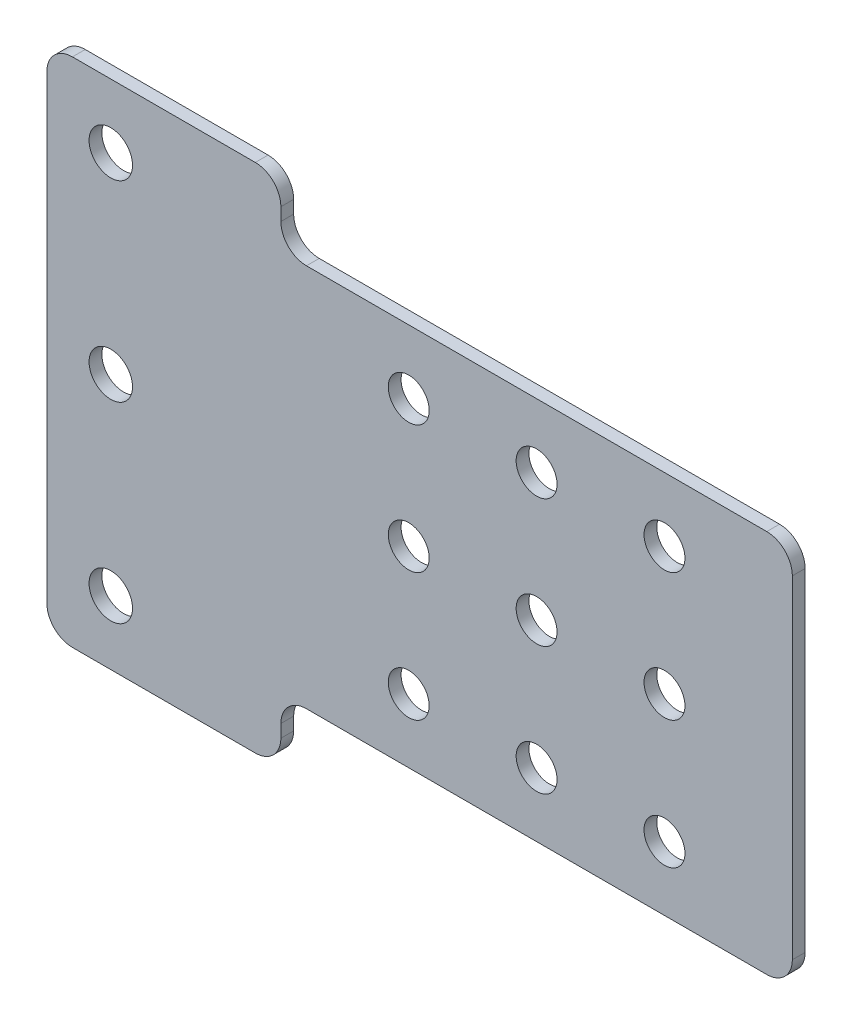
ISO-10303-21;
HEADER;
FILE_DESCRIPTION(('STEP AP214'),'2;1');
FILE_NAME('part.step','',(''),(''),'','','');
FILE_SCHEMA(('AUTOMOTIVE_DESIGN { 1 0 10303 214 1 1 1 1 }'));
ENDSEC;
DATA;
#1=APPLICATION_CONTEXT('core data for automotive mechanical design processes');
#2=APPLICATION_PROTOCOL_DEFINITION('international standard','automotive_design',2000,#1);
#3=PRODUCT_CONTEXT('',#1,'mechanical');
#4=PRODUCT('Part','Part','',(#3));
#5=PRODUCT_RELATED_PRODUCT_CATEGORY('part','',(#4));
#6=PRODUCT_DEFINITION_FORMATION('','',#4);
#7=PRODUCT_DEFINITION_CONTEXT('part definition',#1,'design');
#8=PRODUCT_DEFINITION('design','',#6,#7);
#9=PRODUCT_DEFINITION_SHAPE('','',#8);
#10=(LENGTH_UNIT() NAMED_UNIT(*) SI_UNIT(.MILLI.,.METRE.));
#11=(NAMED_UNIT(*) PLANE_ANGLE_UNIT() SI_UNIT($,.RADIAN.));
#12=(NAMED_UNIT(*) SI_UNIT($,.STERADIAN.) SOLID_ANGLE_UNIT());
#13=UNCERTAINTY_MEASURE_WITH_UNIT(LENGTH_MEASURE(1.E-05),#10,'distance_accuracy_value','');
#14=(GEOMETRIC_REPRESENTATION_CONTEXT(3) GLOBAL_UNCERTAINTY_ASSIGNED_CONTEXT((#13)) GLOBAL_UNIT_ASSIGNED_CONTEXT((#10,
#11,#12)) REPRESENTATION_CONTEXT('',''));
#15=CARTESIAN_POINT('',(0.,0.,0.));
#16=DIRECTION('',(0.,0.,1.));
#17=DIRECTION('',(1.,0.,0.));
#18=AXIS2_PLACEMENT_3D('',#15,#16,#17);
#19=CARTESIAN_POINT('',(0.,0.,1.27));
#20=DIRECTION('',(0.,0.,-1.));
#21=DIRECTION('',(-1.,0.,0.));
#22=AXIS2_PLACEMENT_3D('',#19,#20,#21);
#23=PLANE('',#22);
#24=DIRECTION('',(-1.,0.,0.));
#25=VECTOR('',#24,1.);
#26=CARTESIAN_POINT('',(0.,-25.4,1.27));
#27=LINE('',#26,#25);
#28=CARTESIAN_POINT('',(-27.94,-25.4,1.27));
#29=VERTEX_POINT('',#28);
#30=CARTESIAN_POINT('',(-46.101,-25.4,1.27));
#31=VERTEX_POINT('',#30);
#32=EDGE_CURVE('E345',#29,#31,#27,.T.);
#33=ORIENTED_EDGE('',*,*,#32,.F.);
#34=CARTESIAN_POINT('',(-27.94,-22.86,1.27));
#35=DIRECTION('',(0.,0.,-1.));
#36=DIRECTION('',(-1.,0.,0.));
#37=AXIS2_PLACEMENT_3D('',#34,#35,#36);
#38=CIRCLE('',#37,2.54);
#39=CARTESIAN_POINT('',(-25.4,-22.86,1.27));
#40=VERTEX_POINT('',#39);
#41=EDGE_CURVE('E212',#29,#40,#38,.F.);
#42=ORIENTED_EDGE('',*,*,#41,.T.);
#43=DIRECTION('',(0.,-1.,0.));
#44=VECTOR('',#43,1.);
#45=CARTESIAN_POINT('',(-25.4,0.,1.27));
#46=LINE('',#45,#44);
#47=CARTESIAN_POINT('',(-25.4,-21.59,1.27));
#48=VERTEX_POINT('',#47);
#49=EDGE_CURVE('E249',#48,#40,#46,.T.);
#50=ORIENTED_EDGE('',*,*,#49,.F.);
#51=CARTESIAN_POINT('',(-22.86,-21.59,1.27));
#52=DIRECTION('',(0.,0.,-1.));
#53=DIRECTION('',(-1.,0.,0.));
#54=AXIS2_PLACEMENT_3D('',#51,#52,#53);
#55=CIRCLE('',#54,2.54);
#56=CARTESIAN_POINT('',(-22.86,-19.05,1.27));
#57=VERTEX_POINT('',#56);
#58=EDGE_CURVE('E241',#48,#57,#55,.T.);
#59=ORIENTED_EDGE('',*,*,#58,.T.);
#60=DIRECTION('',(1.,0.,0.));
#61=VECTOR('',#60,1.);
#62=CARTESIAN_POINT('',(-25.4,-19.05,1.27));
#63=LINE('',#62,#61);
#64=CARTESIAN_POINT('',(22.86,-19.05,1.27));
#65=VERTEX_POINT('',#64);
#66=EDGE_CURVE('E180',#57,#65,#63,.T.);
#67=ORIENTED_EDGE('',*,*,#66,.T.);
#68=CARTESIAN_POINT('',(22.86,-16.51,1.27));
#69=DIRECTION('',(0.,0.,-1.));
#70=DIRECTION('',(-1.,0.,0.));
#71=AXIS2_PLACEMENT_3D('',#68,#69,#70);
#72=CIRCLE('',#71,2.54);
#73=CARTESIAN_POINT('',(25.4,-16.51,1.27));
#74=VERTEX_POINT('',#73);
#75=EDGE_CURVE('E189',#65,#74,#72,.F.);
#76=ORIENTED_EDGE('',*,*,#75,.T.);
#77=DIRECTION('',(0.,1.,0.));
#78=VECTOR('',#77,1.);
#79=CARTESIAN_POINT('',(25.4,-19.05,1.27));
#80=LINE('',#79,#78);
#81=CARTESIAN_POINT('',(25.4,16.51,1.27));
#82=VERTEX_POINT('',#81);
#83=EDGE_CURVE('E165',#74,#82,#80,.T.);
#84=ORIENTED_EDGE('',*,*,#83,.T.);
#85=CARTESIAN_POINT('',(22.86,16.51,1.27));
#86=DIRECTION('',(0.,0.,-1.));
#87=DIRECTION('',(-1.,0.,0.));
#88=AXIS2_PLACEMENT_3D('',#85,#86,#87);
#89=CIRCLE('',#88,2.54);
#90=CARTESIAN_POINT('',(22.86,19.05,1.27));
#91=VERTEX_POINT('',#90);
#92=EDGE_CURVE('E187',#82,#91,#89,.F.);
#93=ORIENTED_EDGE('',*,*,#92,.T.);
#94=DIRECTION('',(-1.,0.,0.));
#95=VECTOR('',#94,1.);
#96=CARTESIAN_POINT('',(-25.4,19.05,1.27));
#97=LINE('',#96,#95);
#98=CARTESIAN_POINT('',(-22.86,19.05,1.27));
#99=VERTEX_POINT('',#98);
#100=EDGE_CURVE('E255',#91,#99,#97,.T.);
#101=ORIENTED_EDGE('',*,*,#100,.T.);
#102=CARTESIAN_POINT('',(-22.86,21.59,1.27));
#103=DIRECTION('',(0.,0.,-1.));
#104=DIRECTION('',(-1.,0.,0.));
#105=AXIS2_PLACEMENT_3D('',#102,#103,#104);
#106=CIRCLE('',#105,2.54);
#107=CARTESIAN_POINT('',(-25.4,21.59,1.27));
#108=VERTEX_POINT('',#107);
#109=EDGE_CURVE('E11',#99,#108,#106,.T.);
#110=ORIENTED_EDGE('',*,*,#109,.T.);
#111=CARTESIAN_POINT('',(-25.4,22.86,1.27));
#112=VERTEX_POINT('',#111);
#113=EDGE_CURVE('E337',#112,#108,#46,.T.);
#114=ORIENTED_EDGE('',*,*,#113,.F.);
#115=CARTESIAN_POINT('',(-27.94,22.86,1.27));
#116=DIRECTION('',(0.,0.,-1.));
#117=DIRECTION('',(-1.,0.,0.));
#118=AXIS2_PLACEMENT_3D('',#115,#116,#117);
#119=CIRCLE('',#118,2.54);
#120=CARTESIAN_POINT('',(-27.94,25.4,1.27));
#121=VERTEX_POINT('',#120);
#122=EDGE_CURVE('E208',#112,#121,#119,.F.);
#123=ORIENTED_EDGE('',*,*,#122,.T.);
#124=DIRECTION('',(1.,0.,0.));
#125=VECTOR('',#124,1.);
#126=CARTESIAN_POINT('',(0.,25.4,1.27));
#127=LINE('',#126,#125);
#128=CARTESIAN_POINT('',(-46.101,25.4,1.27));
#129=VERTEX_POINT('',#128);
#130=EDGE_CURVE('E352',#129,#121,#127,.T.);
#131=ORIENTED_EDGE('',*,*,#130,.F.);
#132=CARTESIAN_POINT('',(-46.101,22.86,1.27));
#133=DIRECTION('',(0.,0.,-1.));
#134=DIRECTION('',(-1.,0.,0.));
#135=AXIS2_PLACEMENT_3D('',#132,#133,#134);
#136=CIRCLE('',#135,2.54);
#137=CARTESIAN_POINT('',(-48.641,22.86,1.27));
#138=VERTEX_POINT('',#137);
#139=EDGE_CURVE('E206',#129,#138,#136,.F.);
#140=ORIENTED_EDGE('',*,*,#139,.T.);
#141=DIRECTION('',(0.,1.,0.));
#142=VECTOR('',#141,1.);
#143=CARTESIAN_POINT('',(-48.641,0.,1.27));
#144=LINE('',#143,#142);
#145=CARTESIAN_POINT('',(-48.641,-22.86,1.27));
#146=VERTEX_POINT('',#145);
#147=EDGE_CURVE('E348',#146,#138,#144,.T.);
#148=ORIENTED_EDGE('',*,*,#147,.F.);
#149=CARTESIAN_POINT('',(-46.101,-22.86,1.27));
#150=DIRECTION('',(0.,0.,-1.));
#151=DIRECTION('',(-1.,0.,0.));
#152=AXIS2_PLACEMENT_3D('',#149,#150,#151);
#153=CIRCLE('',#152,2.54);
#154=EDGE_CURVE('E210',#146,#31,#153,.F.);
#155=ORIENTED_EDGE('',*,*,#154,.T.);
#156=EDGE_LOOP('',(#33,#42,#50,#59,#67,#76,#84,#93,#101,#110,#114,#123,#131,#140,#148,#155));
#157=FACE_BOUND('',#156,.T.);
#158=CARTESIAN_POINT('',(-12.7,12.7,1.27));
#159=DIRECTION('',(0.,0.,1.));
#160=DIRECTION('',(1.,0.,0.));
#161=AXIS2_PLACEMENT_3D('',#158,#159,#160);
#162=CIRCLE('',#161,2.032);
#163=CARTESIAN_POINT('',(-10.668,12.7,1.27));
#164=VERTEX_POINT('',#163);
#165=EDGE_CURVE('E172',#164,#164,#162,.T.);
#166=ORIENTED_EDGE('',*,*,#165,.F.);
#167=EDGE_LOOP('',(#166));
#168=FACE_BOUND('',#167,.T.);
#169=CARTESIAN_POINT('',(0.,12.7,1.27));
#170=DIRECTION('',(0.,0.,1.));
#171=DIRECTION('',(1.,0.,0.));
#172=AXIS2_PLACEMENT_3D('',#169,#170,#171);
#173=CIRCLE('',#172,2.032);
#174=CARTESIAN_POINT('',(2.03200000000001,12.7,1.27));
#175=VERTEX_POINT('',#174);
#176=EDGE_CURVE('E317',#175,#175,#173,.T.);
#177=ORIENTED_EDGE('',*,*,#176,.F.);
#178=EDGE_LOOP('',(#177));
#179=FACE_BOUND('',#178,.T.);
#180=CARTESIAN_POINT('',(12.7,12.7,1.27));
#181=DIRECTION('',(0.,0.,1.));
#182=DIRECTION('',(1.,0.,0.));
#183=AXIS2_PLACEMENT_3D('',#180,#181,#182);
#184=CIRCLE('',#183,2.032);
#185=CARTESIAN_POINT('',(14.732,12.7,1.27));
#186=VERTEX_POINT('',#185);
#187=EDGE_CURVE('E311',#186,#186,#184,.T.);
#188=ORIENTED_EDGE('',*,*,#187,.F.);
#189=EDGE_LOOP('',(#188));
#190=FACE_BOUND('',#189,.T.);
#191=CARTESIAN_POINT('',(1.40512601554121E-13,0.,1.27));
#192=DIRECTION('',(0.,0.,1.));
#193=DIRECTION('',(1.,0.,0.));
#194=AXIS2_PLACEMENT_3D('',#191,#192,#193);
#195=CIRCLE('',#194,2.032);
#196=CARTESIAN_POINT('',(2.03200000000014,0.,1.27));
#197=VERTEX_POINT('',#196);
#198=EDGE_CURVE('E305',#197,#197,#195,.T.);
#199=ORIENTED_EDGE('',*,*,#198,.F.);
#200=EDGE_LOOP('',(#199));
#201=FACE_BOUND('',#200,.T.);
#202=CARTESIAN_POINT('',(12.7000000000001,0.,1.27));
#203=DIRECTION('',(0.,0.,1.));
#204=DIRECTION('',(1.,0.,0.));
#205=AXIS2_PLACEMENT_3D('',#202,#203,#204);
#206=CIRCLE('',#205,2.032);
#207=CARTESIAN_POINT('',(14.7320000000001,0.,1.27));
#208=VERTEX_POINT('',#207);
#209=EDGE_CURVE('E299',#208,#208,#206,.T.);
#210=ORIENTED_EDGE('',*,*,#209,.F.);
#211=EDGE_LOOP('',(#210));
#212=FACE_BOUND('',#211,.T.);
#213=CARTESIAN_POINT('',(2.72351585728359E-13,-12.7,1.27));
#214=DIRECTION('',(0.,0.,1.));
#215=DIRECTION('',(1.,0.,0.));
#216=AXIS2_PLACEMENT_3D('',#213,#214,#215);
#217=CIRCLE('',#216,2.032);
#218=CARTESIAN_POINT('',(2.03200000000027,-12.7,1.27));
#219=VERTEX_POINT('',#218);
#220=EDGE_CURVE('E293',#219,#219,#217,.T.);
#221=ORIENTED_EDGE('',*,*,#220,.F.);
#222=EDGE_LOOP('',(#221));
#223=FACE_BOUND('',#222,.T.);
#224=CARTESIAN_POINT('',(12.7000000000003,-12.7,1.27));
#225=DIRECTION('',(0.,0.,1.));
#226=DIRECTION('',(1.,0.,0.));
#227=AXIS2_PLACEMENT_3D('',#224,#225,#226);
#228=CIRCLE('',#227,2.032);
#229=CARTESIAN_POINT('',(14.7320000000003,-12.7,1.27));
#230=VERTEX_POINT('',#229);
#231=EDGE_CURVE('E287',#230,#230,#228,.T.);
#232=ORIENTED_EDGE('',*,*,#231,.F.);
#233=EDGE_LOOP('',(#232));
#234=FACE_BOUND('',#233,.T.);
#235=CARTESIAN_POINT('',(-12.6999999999999,0.,1.27));
#236=DIRECTION('',(0.,0.,1.));
#237=DIRECTION('',(1.,0.,0.));
#238=AXIS2_PLACEMENT_3D('',#235,#236,#237);
#239=CIRCLE('',#238,2.032);
#240=CARTESIAN_POINT('',(-10.6679999999999,0.,1.27));
#241=VERTEX_POINT('',#240);
#242=EDGE_CURVE('E281',#241,#241,#239,.T.);
#243=ORIENTED_EDGE('',*,*,#242,.F.);
#244=EDGE_LOOP('',(#243));
#245=FACE_BOUND('',#244,.T.);
#246=CARTESIAN_POINT('',(-12.6999999999997,-12.7,1.27));
#247=DIRECTION('',(0.,0.,1.));
#248=DIRECTION('',(1.,0.,0.));
#249=AXIS2_PLACEMENT_3D('',#246,#247,#248);
#250=CIRCLE('',#249,2.032);
#251=CARTESIAN_POINT('',(-10.6679999999997,-12.7,1.27));
#252=VERTEX_POINT('',#251);
#253=EDGE_CURVE('E273',#252,#252,#250,.T.);
#254=ORIENTED_EDGE('',*,*,#253,.F.);
#255=EDGE_LOOP('',(#254));
#256=FACE_BOUND('',#255,.T.);
#257=CARTESIAN_POINT('',(-42.291,19.05,1.27));
#258=DIRECTION('',(0.,0.,1.));
#259=DIRECTION('',(1.,0.,0.));
#260=AXIS2_PLACEMENT_3D('',#257,#258,#259);
#261=CIRCLE('',#260,2.159);
#262=CARTESIAN_POINT('',(-40.132,19.05,1.27));
#263=VERTEX_POINT('',#262);
#264=EDGE_CURVE('E360',#263,#263,#261,.T.);
#265=ORIENTED_EDGE('',*,*,#264,.F.);
#266=EDGE_LOOP('',(#265));
#267=FACE_BOUND('',#266,.T.);
#268=CARTESIAN_POINT('',(-42.291,-19.05,1.27));
#269=DIRECTION('',(0.,0.,1.));
#270=DIRECTION('',(1.,0.,0.));
#271=AXIS2_PLACEMENT_3D('',#268,#269,#270);
#272=CIRCLE('',#271,2.159);
#273=CARTESIAN_POINT('',(-40.132,-19.05,1.27));
#274=VERTEX_POINT('',#273);
#275=EDGE_CURVE('E357',#274,#274,#272,.T.);
#276=ORIENTED_EDGE('',*,*,#275,.F.);
#277=EDGE_LOOP('',(#276));
#278=FACE_BOUND('',#277,.T.);
#279=CARTESIAN_POINT('',(-42.291,0.,1.27));
#280=DIRECTION('',(0.,0.,1.));
#281=DIRECTION('',(1.,0.,0.));
#282=AXIS2_PLACEMENT_3D('',#279,#280,#281);
#283=CIRCLE('',#282,2.159);
#284=CARTESIAN_POINT('',(-40.132,0.,1.27));
#285=VERTEX_POINT('',#284);
#286=EDGE_CURVE('E354',#285,#285,#283,.T.);
#287=ORIENTED_EDGE('',*,*,#286,.F.);
#288=EDGE_LOOP('',(#287));
#289=FACE_BOUND('',#288,.T.);
#290=ADVANCED_FACE('F34',(#157,#168,#179,#190,#201,#212,#223,#234,#245,#256,#267,#278,#289),#23,.F.);
#291=CARTESIAN_POINT('',(0.,0.,0.));
#292=DIRECTION('',(0.,0.,-1.));
#293=DIRECTION('',(-1.,0.,0.));
#294=AXIS2_PLACEMENT_3D('',#291,#292,#293);
#295=PLANE('',#294);
#296=CARTESIAN_POINT('',(-12.6999999999999,0.,0.));
#297=DIRECTION('',(0.,0.,1.));
#298=DIRECTION('',(1.,0.,0.));
#299=AXIS2_PLACEMENT_3D('',#296,#297,#298);
#300=CIRCLE('',#299,2.032);
#301=CARTESIAN_POINT('',(-10.6679999999999,0.,0.));
#302=VERTEX_POINT('',#301);
#303=EDGE_CURVE('E276',#302,#302,#300,.T.);
#304=ORIENTED_EDGE('',*,*,#303,.T.);
#305=EDGE_LOOP('',(#304));
#306=FACE_BOUND('',#305,.T.);
#307=CARTESIAN_POINT('',(2.72351585728359E-13,-12.7,0.));
#308=DIRECTION('',(0.,0.,1.));
#309=DIRECTION('',(1.,0.,0.));
#310=AXIS2_PLACEMENT_3D('',#307,#308,#309);
#311=CIRCLE('',#310,2.032);
#312=CARTESIAN_POINT('',(2.03200000000027,-12.7,0.));
#313=VERTEX_POINT('',#312);
#314=EDGE_CURVE('E290',#313,#313,#311,.T.);
#315=ORIENTED_EDGE('',*,*,#314,.T.);
#316=EDGE_LOOP('',(#315));
#317=FACE_BOUND('',#316,.T.);
#318=CARTESIAN_POINT('',(1.40512601554121E-13,0.,0.));
#319=DIRECTION('',(0.,0.,1.));
#320=DIRECTION('',(1.,0.,0.));
#321=AXIS2_PLACEMENT_3D('',#318,#319,#320);
#322=CIRCLE('',#321,2.032);
#323=CARTESIAN_POINT('',(2.03200000000014,0.,0.));
#324=VERTEX_POINT('',#323);
#325=EDGE_CURVE('E302',#324,#324,#322,.T.);
#326=ORIENTED_EDGE('',*,*,#325,.T.);
#327=EDGE_LOOP('',(#326));
#328=FACE_BOUND('',#327,.T.);
#329=CARTESIAN_POINT('',(0.,12.7,0.));
#330=DIRECTION('',(0.,0.,1.));
#331=DIRECTION('',(1.,0.,0.));
#332=AXIS2_PLACEMENT_3D('',#329,#330,#331);
#333=CIRCLE('',#332,2.032);
#334=CARTESIAN_POINT('',(2.03200000000001,12.7,0.));
#335=VERTEX_POINT('',#334);
#336=EDGE_CURVE('E314',#335,#335,#333,.T.);
#337=ORIENTED_EDGE('',*,*,#336,.T.);
#338=EDGE_LOOP('',(#337));
#339=FACE_BOUND('',#338,.T.);
#340=DIRECTION('',(0.,-1.,0.));
#341=VECTOR('',#340,1.);
#342=CARTESIAN_POINT('',(-25.4,0.,0.));
#343=LINE('',#342,#341);
#344=CARTESIAN_POINT('',(-25.4,-21.59,0.));
#345=VERTEX_POINT('',#344);
#346=CARTESIAN_POINT('',(-25.4,-22.86,0.));
#347=VERTEX_POINT('',#346);
#348=EDGE_CURVE('E258',#345,#347,#343,.T.);
#349=ORIENTED_EDGE('',*,*,#348,.T.);
#350=CARTESIAN_POINT('',(-27.94,-22.86,0.));
#351=DIRECTION('',(0.,0.,-1.));
#352=DIRECTION('',(-1.,0.,0.));
#353=AXIS2_PLACEMENT_3D('',#350,#351,#352);
#354=CIRCLE('',#353,2.54);
#355=CARTESIAN_POINT('',(-27.94,-25.4,0.));
#356=VERTEX_POINT('',#355);
#357=EDGE_CURVE('E220',#347,#356,#354,.T.);
#358=ORIENTED_EDGE('',*,*,#357,.T.);
#359=DIRECTION('',(-1.,0.,0.));
#360=VECTOR('',#359,1.);
#361=CARTESIAN_POINT('',(0.,-25.4,0.));
#362=LINE('',#361,#360);
#363=CARTESIAN_POINT('',(-46.101,-25.4,0.));
#364=VERTEX_POINT('',#363);
#365=EDGE_CURVE('E266',#356,#364,#362,.T.);
#366=ORIENTED_EDGE('',*,*,#365,.T.);
#367=CARTESIAN_POINT('',(-46.101,-22.86,0.));
#368=DIRECTION('',(0.,0.,-1.));
#369=DIRECTION('',(-1.,0.,0.));
#370=AXIS2_PLACEMENT_3D('',#367,#368,#369);
#371=CIRCLE('',#370,2.54);
#372=CARTESIAN_POINT('',(-48.641,-22.86,0.));
#373=VERTEX_POINT('',#372);
#374=EDGE_CURVE('E218',#364,#373,#371,.T.);
#375=ORIENTED_EDGE('',*,*,#374,.T.);
#376=DIRECTION('',(0.,1.,0.));
#377=VECTOR('',#376,1.);
#378=CARTESIAN_POINT('',(-48.641,0.,0.));
#379=LINE('',#378,#377);
#380=CARTESIAN_POINT('',(-48.641,22.86,0.));
#381=VERTEX_POINT('',#380);
#382=EDGE_CURVE('E368',#373,#381,#379,.T.);
#383=ORIENTED_EDGE('',*,*,#382,.T.);
#384=CARTESIAN_POINT('',(-46.101,22.86,0.));
#385=DIRECTION('',(0.,0.,-1.));
#386=DIRECTION('',(-1.,0.,0.));
#387=AXIS2_PLACEMENT_3D('',#384,#385,#386);
#388=CIRCLE('',#387,2.54);
#389=CARTESIAN_POINT('',(-46.101,25.4,0.));
#390=VERTEX_POINT('',#389);
#391=EDGE_CURVE('E214',#381,#390,#388,.T.);
#392=ORIENTED_EDGE('',*,*,#391,.T.);
#393=DIRECTION('',(1.,0.,0.));
#394=VECTOR('',#393,1.);
#395=CARTESIAN_POINT('',(0.,25.4,0.));
#396=LINE('',#395,#394);
#397=CARTESIAN_POINT('',(-27.94,25.4,0.));
#398=VERTEX_POINT('',#397);
#399=EDGE_CURVE('E264',#390,#398,#396,.T.);
#400=ORIENTED_EDGE('',*,*,#399,.T.);
#401=CARTESIAN_POINT('',(-27.94,22.86,0.));
#402=DIRECTION('',(0.,0.,-1.));
#403=DIRECTION('',(-1.,0.,0.));
#404=AXIS2_PLACEMENT_3D('',#401,#402,#403);
#405=CIRCLE('',#404,2.54);
#406=CARTESIAN_POINT('',(-25.4,22.86,0.));
#407=VERTEX_POINT('',#406);
#408=EDGE_CURVE('E216',#398,#407,#405,.T.);
#409=ORIENTED_EDGE('',*,*,#408,.T.);
#410=CARTESIAN_POINT('',(-25.4,21.59,0.));
#411=VERTEX_POINT('',#410);
#412=EDGE_CURVE('E263',#407,#411,#343,.T.);
#413=ORIENTED_EDGE('',*,*,#412,.T.);
#414=CARTESIAN_POINT('',(-22.86,21.59,0.));
#415=DIRECTION('',(0.,0.,-1.));
#416=DIRECTION('',(-1.,0.,0.));
#417=AXIS2_PLACEMENT_3D('',#414,#415,#416);
#418=CIRCLE('',#417,2.54);
#419=CARTESIAN_POINT('',(-22.86,19.05,0.));
#420=VERTEX_POINT('',#419);
#421=EDGE_CURVE('E42',#411,#420,#418,.F.);
#422=ORIENTED_EDGE('',*,*,#421,.T.);
#423=DIRECTION('',(-1.,0.,0.));
#424=VECTOR('',#423,1.);
#425=CARTESIAN_POINT('',(-25.4,19.05,0.));
#426=LINE('',#425,#424);
#427=CARTESIAN_POINT('',(22.86,19.05,0.));
#428=VERTEX_POINT('',#427);
#429=EDGE_CURVE('E171',#428,#420,#426,.T.);
#430=ORIENTED_EDGE('',*,*,#429,.F.);
#431=CARTESIAN_POINT('',(22.86,16.51,0.));
#432=DIRECTION('',(0.,0.,-1.));
#433=DIRECTION('',(-1.,0.,0.));
#434=AXIS2_PLACEMENT_3D('',#431,#432,#433);
#435=CIRCLE('',#434,2.54);
#436=CARTESIAN_POINT('',(25.4,16.51,0.));
#437=VERTEX_POINT('',#436);
#438=EDGE_CURVE('E156',#428,#437,#435,.T.);
#439=ORIENTED_EDGE('',*,*,#438,.T.);
#440=DIRECTION('',(0.,1.,0.));
#441=VECTOR('',#440,1.);
#442=CARTESIAN_POINT('',(25.4,-19.05,0.));
#443=LINE('',#442,#441);
#444=CARTESIAN_POINT('',(25.4,-16.51,0.));
#445=VERTEX_POINT('',#444);
#446=EDGE_CURVE('E162',#445,#437,#443,.T.);
#447=ORIENTED_EDGE('',*,*,#446,.F.);
#448=CARTESIAN_POINT('',(22.86,-16.51,0.));
#449=DIRECTION('',(0.,0.,-1.));
#450=DIRECTION('',(-1.,0.,0.));
#451=AXIS2_PLACEMENT_3D('',#448,#449,#450);
#452=CIRCLE('',#451,2.54);
#453=CARTESIAN_POINT('',(22.86,-19.05,0.));
#454=VERTEX_POINT('',#453);
#455=EDGE_CURVE('E147',#445,#454,#452,.T.);
#456=ORIENTED_EDGE('',*,*,#455,.T.);
#457=DIRECTION('',(1.,0.,0.));
#458=VECTOR('',#457,1.);
#459=CARTESIAN_POINT('',(-25.4,-19.05,0.));
#460=LINE('',#459,#458);
#461=CARTESIAN_POINT('',(-22.86,-19.05,0.));
#462=VERTEX_POINT('',#461);
#463=EDGE_CURVE('E174',#462,#454,#460,.T.);
#464=ORIENTED_EDGE('',*,*,#463,.F.);
#465=CARTESIAN_POINT('',(-22.86,-21.59,0.));
#466=DIRECTION('',(0.,0.,-1.));
#467=DIRECTION('',(-1.,0.,0.));
#468=AXIS2_PLACEMENT_3D('',#465,#466,#467);
#469=CIRCLE('',#468,2.54);
#470=EDGE_CURVE('E239',#462,#345,#469,.F.);
#471=ORIENTED_EDGE('',*,*,#470,.T.);
#472=EDGE_LOOP('',(#349,#358,#366,#375,#383,#392,#400,#409,#413,#422,#430,#439,#447,#456,#464,#471));
#473=FACE_BOUND('',#472,.T.);
#474=CARTESIAN_POINT('',(-12.7,12.7,0.));
#475=DIRECTION('',(0.,0.,1.));
#476=DIRECTION('',(1.,0.,0.));
#477=AXIS2_PLACEMENT_3D('',#474,#475,#476);
#478=CIRCLE('',#477,2.032);
#479=CARTESIAN_POINT('',(-10.668,12.7,0.));
#480=VERTEX_POINT('',#479);
#481=EDGE_CURVE('E177',#480,#480,#478,.T.);
#482=ORIENTED_EDGE('',*,*,#481,.T.);
#483=EDGE_LOOP('',(#482));
#484=FACE_BOUND('',#483,.T.);
#485=CARTESIAN_POINT('',(12.7,12.7,0.));
#486=DIRECTION('',(0.,0.,1.));
#487=DIRECTION('',(1.,0.,0.));
#488=AXIS2_PLACEMENT_3D('',#485,#486,#487);
#489=CIRCLE('',#488,2.032);
#490=CARTESIAN_POINT('',(14.732,12.7,0.));
#491=VERTEX_POINT('',#490);
#492=EDGE_CURVE('E308',#491,#491,#489,.T.);
#493=ORIENTED_EDGE('',*,*,#492,.T.);
#494=EDGE_LOOP('',(#493));
#495=FACE_BOUND('',#494,.T.);
#496=CARTESIAN_POINT('',(12.7000000000001,0.,0.));
#497=DIRECTION('',(0.,0.,1.));
#498=DIRECTION('',(1.,0.,0.));
#499=AXIS2_PLACEMENT_3D('',#496,#497,#498);
#500=CIRCLE('',#499,2.032);
#501=CARTESIAN_POINT('',(14.7320000000001,0.,0.));
#502=VERTEX_POINT('',#501);
#503=EDGE_CURVE('E296',#502,#502,#500,.T.);
#504=ORIENTED_EDGE('',*,*,#503,.T.);
#505=EDGE_LOOP('',(#504));
#506=FACE_BOUND('',#505,.T.);
#507=CARTESIAN_POINT('',(12.7000000000003,-12.7,0.));
#508=DIRECTION('',(0.,0.,1.));
#509=DIRECTION('',(1.,0.,0.));
#510=AXIS2_PLACEMENT_3D('',#507,#508,#509);
#511=CIRCLE('',#510,2.032);
#512=CARTESIAN_POINT('',(14.7320000000003,-12.7,0.));
#513=VERTEX_POINT('',#512);
#514=EDGE_CURVE('E284',#513,#513,#511,.T.);
#515=ORIENTED_EDGE('',*,*,#514,.T.);
#516=EDGE_LOOP('',(#515));
#517=FACE_BOUND('',#516,.T.);
#518=CARTESIAN_POINT('',(-12.6999999999997,-12.7,0.));
#519=DIRECTION('',(0.,0.,1.));
#520=DIRECTION('',(1.,0.,0.));
#521=AXIS2_PLACEMENT_3D('',#518,#519,#520);
#522=CIRCLE('',#521,2.032);
#523=CARTESIAN_POINT('',(-10.6679999999997,-12.7,0.));
#524=VERTEX_POINT('',#523);
#525=EDGE_CURVE('E277',#524,#524,#522,.T.);
#526=ORIENTED_EDGE('',*,*,#525,.T.);
#527=EDGE_LOOP('',(#526));
#528=FACE_BOUND('',#527,.T.);
#529=CARTESIAN_POINT('',(-42.291,-19.05,0.));
#530=DIRECTION('',(0.,0.,-1.));
#531=DIRECTION('',(-1.,0.,0.));
#532=AXIS2_PLACEMENT_3D('',#529,#530,#531);
#533=CIRCLE('',#532,2.159);
#534=CARTESIAN_POINT('',(-44.45,-19.05,0.));
#535=VERTEX_POINT('',#534);
#536=EDGE_CURVE('E268',#535,#535,#533,.F.);
#537=ORIENTED_EDGE('',*,*,#536,.T.);
#538=EDGE_LOOP('',(#537));
#539=FACE_BOUND('',#538,.T.);
#540=CARTESIAN_POINT('',(-42.291,19.05,0.));
#541=DIRECTION('',(0.,0.,-1.));
#542=DIRECTION('',(-1.,0.,0.));
#543=AXIS2_PLACEMENT_3D('',#540,#541,#542);
#544=CIRCLE('',#543,2.159);
#545=CARTESIAN_POINT('',(-44.45,19.05,0.));
#546=VERTEX_POINT('',#545);
#547=EDGE_CURVE('E365',#546,#546,#544,.F.);
#548=ORIENTED_EDGE('',*,*,#547,.T.);
#549=EDGE_LOOP('',(#548));
#550=FACE_BOUND('',#549,.T.);
#551=CARTESIAN_POINT('',(-42.291,0.,0.));
#552=DIRECTION('',(0.,0.,-1.));
#553=DIRECTION('',(-1.,0.,0.));
#554=AXIS2_PLACEMENT_3D('',#551,#552,#553);
#555=CIRCLE('',#554,2.159);
#556=CARTESIAN_POINT('',(-44.45,0.,0.));
#557=VERTEX_POINT('',#556);
#558=EDGE_CURVE('E280',#557,#557,#555,.F.);
#559=ORIENTED_EDGE('',*,*,#558,.T.);
#560=EDGE_LOOP('',(#559));
#561=FACE_BOUND('',#560,.T.);
#562=ADVANCED_FACE('F169',(#306,#317,#328,#339,#473,#484,#495,#506,#517,#528,#539,#550,#561),
#295,.T.);
#563=CARTESIAN_POINT('',(25.4,-19.05,1.27));
#564=DIRECTION('',(-1.,0.,0.));
#565=DIRECTION('',(0.,0.,1.));
#566=AXIS2_PLACEMENT_3D('',#563,#564,#565);
#567=PLANE('',#566);
#568=ORIENTED_EDGE('',*,*,#83,.F.);
#569=DIRECTION('',(0.,0.,-1.));
#570=VECTOR('',#569,1.);
#571=CARTESIAN_POINT('',(25.4,-16.51,1.27));
#572=LINE('',#571,#570);
#573=EDGE_CURVE('E151',#74,#445,#572,.T.);
#574=ORIENTED_EDGE('',*,*,#573,.T.);
#575=ORIENTED_EDGE('',*,*,#446,.T.);
#576=DIRECTION('',(0.,0.,-1.));
#577=VECTOR('',#576,1.);
#578=CARTESIAN_POINT('',(25.4,16.51,1.27));
#579=LINE('',#578,#577);
#580=EDGE_CURVE('E166',#437,#82,#579,.F.);
#581=ORIENTED_EDGE('',*,*,#580,.T.);
#582=EDGE_LOOP('',(#568,#574,#575,#581));
#583=FACE_BOUND('',#582,.T.);
#584=ADVANCED_FACE('F161',(#583),#567,.F.);
#585=CARTESIAN_POINT('',(-25.4,19.05,1.27));
#586=DIRECTION('',(0.,-1.,0.));
#587=DIRECTION('',(0.,0.,-1.));
#588=AXIS2_PLACEMENT_3D('',#585,#586,#587);
#589=PLANE('',#588);
#590=ORIENTED_EDGE('',*,*,#429,.T.);
#591=DIRECTION('',(0.,0.,-1.));
#592=VECTOR('',#591,1.);
#593=CARTESIAN_POINT('',(-22.86,19.05,1.27));
#594=LINE('',#593,#592);
#595=EDGE_CURVE('E232',#420,#99,#594,.F.);
#596=ORIENTED_EDGE('',*,*,#595,.T.);
#597=ORIENTED_EDGE('',*,*,#100,.F.);
#598=DIRECTION('',(0.,0.,-1.));
#599=VECTOR('',#598,1.);
#600=CARTESIAN_POINT('',(22.86,19.05,1.27));
#601=LINE('',#600,#599);
#602=EDGE_CURVE('E191',#91,#428,#601,.T.);
#603=ORIENTED_EDGE('',*,*,#602,.T.);
#604=EDGE_LOOP('',(#590,#596,#597,#603));
#605=FACE_BOUND('',#604,.T.);
#606=ADVANCED_FACE('F417',(#605),#589,.F.);
#607=CARTESIAN_POINT('',(-25.4,-19.05,1.27));
#608=DIRECTION('',(0.,1.,0.));
#609=DIRECTION('',(0.,0.,1.));
#610=AXIS2_PLACEMENT_3D('',#607,#608,#609);
#611=PLANE('',#610);
#612=ORIENTED_EDGE('',*,*,#66,.F.);
#613=DIRECTION('',(0.,0.,-1.));
#614=VECTOR('',#613,1.);
#615=CARTESIAN_POINT('',(-22.86,-19.05,0.));
#616=LINE('',#615,#614);
#617=EDGE_CURVE('E194',#57,#462,#616,.T.);
#618=ORIENTED_EDGE('',*,*,#617,.T.);
#619=ORIENTED_EDGE('',*,*,#463,.T.);
#620=DIRECTION('',(0.,0.,-1.));
#621=VECTOR('',#620,1.);
#622=CARTESIAN_POINT('',(22.86,-19.05,1.27));
#623=LINE('',#622,#621);
#624=EDGE_CURVE('E153',#454,#65,#623,.F.);
#625=ORIENTED_EDGE('',*,*,#624,.T.);
#626=EDGE_LOOP('',(#612,#618,#619,#625));
#627=FACE_BOUND('',#626,.T.);
#628=ADVANCED_FACE('F254',(#627),#611,.F.);
#629=CARTESIAN_POINT('',(-12.7,12.7,1.27));
#630=DIRECTION('',(0.,0.,-1.));
#631=DIRECTION('',(-1.,0.,0.));
#632=AXIS2_PLACEMENT_3D('',#629,#630,#631);
#633=CYLINDRICAL_SURFACE('',#632,2.032);
#634=ORIENTED_EDGE('',*,*,#165,.T.);
#635=EDGE_LOOP('',(#634));
#636=FACE_BOUND('',#635,.T.);
#637=ORIENTED_EDGE('',*,*,#481,.F.);
#638=EDGE_LOOP('',(#637));
#639=FACE_BOUND('',#638,.T.);
#640=ADVANCED_FACE('F412',(#636,#639),#633,.F.);
#641=CARTESIAN_POINT('',(0.,12.7,1.27));
#642=DIRECTION('',(0.,0.,-1.));
#643=DIRECTION('',(-1.,0.,0.));
#644=AXIS2_PLACEMENT_3D('',#641,#642,#643);
#645=CYLINDRICAL_SURFACE('',#644,2.032);
#646=ORIENTED_EDGE('',*,*,#176,.T.);
#647=EDGE_LOOP('',(#646));
#648=FACE_BOUND('',#647,.T.);
#649=ORIENTED_EDGE('',*,*,#336,.F.);
#650=EDGE_LOOP('',(#649));
#651=FACE_BOUND('',#650,.T.);
#652=ADVANCED_FACE('F646',(#648,#651),#645,.F.);
#653=CARTESIAN_POINT('',(12.7,12.7,1.27));
#654=DIRECTION('',(0.,0.,-1.));
#655=DIRECTION('',(-1.,0.,0.));
#656=AXIS2_PLACEMENT_3D('',#653,#654,#655);
#657=CYLINDRICAL_SURFACE('',#656,2.032);
#658=ORIENTED_EDGE('',*,*,#187,.T.);
#659=EDGE_LOOP('',(#658));
#660=FACE_BOUND('',#659,.T.);
#661=ORIENTED_EDGE('',*,*,#492,.F.);
#662=EDGE_LOOP('',(#661));
#663=FACE_BOUND('',#662,.T.);
#664=ADVANCED_FACE('F636',(#660,#663),#657,.F.);
#665=CARTESIAN_POINT('',(1.40512601554121E-13,0.,1.27));
#666=DIRECTION('',(0.,0.,-1.));
#667=DIRECTION('',(-1.,0.,0.));
#668=AXIS2_PLACEMENT_3D('',#665,#666,#667);
#669=CYLINDRICAL_SURFACE('',#668,2.032);
#670=ORIENTED_EDGE('',*,*,#198,.T.);
#671=EDGE_LOOP('',(#670));
#672=FACE_BOUND('',#671,.T.);
#673=ORIENTED_EDGE('',*,*,#325,.F.);
#674=EDGE_LOOP('',(#673));
#675=FACE_BOUND('',#674,.T.);
#676=ADVANCED_FACE('F626',(#672,#675),#669,.F.);
#677=CARTESIAN_POINT('',(12.7000000000001,0.,1.27));
#678=DIRECTION('',(0.,0.,-1.));
#679=DIRECTION('',(-1.,0.,0.));
#680=AXIS2_PLACEMENT_3D('',#677,#678,#679);
#681=CYLINDRICAL_SURFACE('',#680,2.032);
#682=ORIENTED_EDGE('',*,*,#209,.T.);
#683=EDGE_LOOP('',(#682));
#684=FACE_BOUND('',#683,.T.);
#685=ORIENTED_EDGE('',*,*,#503,.F.);
#686=EDGE_LOOP('',(#685));
#687=FACE_BOUND('',#686,.T.);
#688=ADVANCED_FACE('F616',(#684,#687),#681,.F.);
#689=CARTESIAN_POINT('',(2.72351585728359E-13,-12.7,1.27));
#690=DIRECTION('',(0.,0.,-1.));
#691=DIRECTION('',(-1.,0.,0.));
#692=AXIS2_PLACEMENT_3D('',#689,#690,#691);
#693=CYLINDRICAL_SURFACE('',#692,2.032);
#694=ORIENTED_EDGE('',*,*,#220,.T.);
#695=EDGE_LOOP('',(#694));
#696=FACE_BOUND('',#695,.T.);
#697=ORIENTED_EDGE('',*,*,#314,.F.);
#698=EDGE_LOOP('',(#697));
#699=FACE_BOUND('',#698,.T.);
#700=ADVANCED_FACE('F606',(#696,#699),#693,.F.);
#701=CARTESIAN_POINT('',(12.7000000000003,-12.7,1.27));
#702=DIRECTION('',(0.,0.,-1.));
#703=DIRECTION('',(-1.,0.,0.));
#704=AXIS2_PLACEMENT_3D('',#701,#702,#703);
#705=CYLINDRICAL_SURFACE('',#704,2.032);
#706=ORIENTED_EDGE('',*,*,#231,.T.);
#707=EDGE_LOOP('',(#706));
#708=FACE_BOUND('',#707,.T.);
#709=ORIENTED_EDGE('',*,*,#514,.F.);
#710=EDGE_LOOP('',(#709));
#711=FACE_BOUND('',#710,.T.);
#712=ADVANCED_FACE('F596',(#708,#711),#705,.F.);
#713=CARTESIAN_POINT('',(-12.6999999999999,0.,1.27));
#714=DIRECTION('',(0.,0.,-1.));
#715=DIRECTION('',(-1.,0.,0.));
#716=AXIS2_PLACEMENT_3D('',#713,#714,#715);
#717=CYLINDRICAL_SURFACE('',#716,2.032);
#718=ORIENTED_EDGE('',*,*,#242,.T.);
#719=EDGE_LOOP('',(#718));
#720=FACE_BOUND('',#719,.T.);
#721=ORIENTED_EDGE('',*,*,#303,.F.);
#722=EDGE_LOOP('',(#721));
#723=FACE_BOUND('',#722,.T.);
#724=ADVANCED_FACE('F586',(#720,#723),#717,.F.);
#725=CARTESIAN_POINT('',(-12.6999999999997,-12.7,1.27));
#726=DIRECTION('',(0.,0.,-1.));
#727=DIRECTION('',(-1.,0.,0.));
#728=AXIS2_PLACEMENT_3D('',#725,#726,#727);
#729=CYLINDRICAL_SURFACE('',#728,2.032);
#730=ORIENTED_EDGE('',*,*,#253,.T.);
#731=EDGE_LOOP('',(#730));
#732=FACE_BOUND('',#731,.T.);
#733=ORIENTED_EDGE('',*,*,#525,.F.);
#734=EDGE_LOOP('',(#733));
#735=FACE_BOUND('',#734,.T.);
#736=ADVANCED_FACE('F425',(#732,#735),#729,.F.);
#737=CARTESIAN_POINT('',(22.86,-16.51,1.27));
#738=DIRECTION('',(0.,0.,-1.));
#739=DIRECTION('',(-1.,0.,0.));
#740=AXIS2_PLACEMENT_3D('',#737,#738,#739);
#741=CYLINDRICAL_SURFACE('',#740,2.54);
#742=ORIENTED_EDGE('',*,*,#75,.F.);
#743=ORIENTED_EDGE('',*,*,#624,.F.);
#744=ORIENTED_EDGE('',*,*,#455,.F.);
#745=ORIENTED_EDGE('',*,*,#573,.F.);
#746=EDGE_LOOP('',(#742,#743,#744,#745));
#747=FACE_BOUND('',#746,.T.);
#748=ADVANCED_FACE('F150',(#747),#741,.T.);
#749=CARTESIAN_POINT('',(22.86,16.51,1.27));
#750=DIRECTION('',(0.,0.,-1.));
#751=DIRECTION('',(-1.,0.,0.));
#752=AXIS2_PLACEMENT_3D('',#749,#750,#751);
#753=CYLINDRICAL_SURFACE('',#752,2.54);
#754=ORIENTED_EDGE('',*,*,#92,.F.);
#755=ORIENTED_EDGE('',*,*,#580,.F.);
#756=ORIENTED_EDGE('',*,*,#438,.F.);
#757=ORIENTED_EDGE('',*,*,#602,.F.);
#758=EDGE_LOOP('',(#754,#755,#756,#757));
#759=FACE_BOUND('',#758,.T.);
#760=ADVANCED_FACE('F424',(#759),#753,.T.);
#761=CARTESIAN_POINT('',(-25.4,0.,-55.8639783850023));
#762=DIRECTION('',(-1.,0.,0.));
#763=DIRECTION('',(0.,0.,1.));
#764=AXIS2_PLACEMENT_3D('',#761,#762,#763);
#765=PLANE('',#764);
#766=ORIENTED_EDGE('',*,*,#113,.T.);
#767=DIRECTION('',(0.,0.,-1.));
#768=VECTOR('',#767,1.);
#769=CARTESIAN_POINT('',(-25.4,21.59,0.));
#770=LINE('',#769,#768);
#771=EDGE_CURVE('E230',#108,#411,#770,.T.);
#772=ORIENTED_EDGE('',*,*,#771,.T.);
#773=ORIENTED_EDGE('',*,*,#412,.F.);
#774=DIRECTION('',(0.,0.,1.));
#775=VECTOR('',#774,1.);
#776=CARTESIAN_POINT('',(-25.4,22.86,-55.8639783850023));
#777=LINE('',#776,#775);
#778=EDGE_CURVE('E227',#407,#112,#777,.T.);
#779=ORIENTED_EDGE('',*,*,#778,.T.);
#780=EDGE_LOOP('',(#766,#772,#773,#779));
#781=FACE_BOUND('',#780,.T.);
#782=ADVANCED_FACE('F335',(#781),#765,.F.);
#783=ORIENTED_EDGE('',*,*,#348,.F.);
#784=DIRECTION('',(0.,0.,-1.));
#785=VECTOR('',#784,1.);
#786=CARTESIAN_POINT('',(-25.4,-21.59,1.27));
#787=LINE('',#786,#785);
#788=EDGE_CURVE('E199',#345,#48,#787,.F.);
#789=ORIENTED_EDGE('',*,*,#788,.T.);
#790=ORIENTED_EDGE('',*,*,#49,.T.);
#791=DIRECTION('',(0.,0.,1.));
#792=VECTOR('',#791,1.);
#793=CARTESIAN_POINT('',(-25.4,-22.86,-55.8639783850023));
#794=LINE('',#793,#792);
#795=EDGE_CURVE('E197',#40,#347,#794,.F.);
#796=ORIENTED_EDGE('',*,*,#795,.T.);
#797=EDGE_LOOP('',(#783,#789,#790,#796));
#798=FACE_BOUND('',#797,.T.);
#799=ADVANCED_FACE('F261',(#798),#765,.F.);
#800=CARTESIAN_POINT('',(0.,-25.4,-55.8639783850023));
#801=DIRECTION('',(0.,1.,0.));
#802=DIRECTION('',(-1.,0.,0.));
#803=AXIS2_PLACEMENT_3D('',#800,#801,#802);
#804=PLANE('',#803);
#805=ORIENTED_EDGE('',*,*,#365,.F.);
#806=DIRECTION('',(0.,0.,1.));
#807=VECTOR('',#806,1.);
#808=CARTESIAN_POINT('',(-27.94,-25.4,-55.8639783850023));
#809=LINE('',#808,#807);
#810=EDGE_CURVE('E203',#356,#29,#809,.T.);
#811=ORIENTED_EDGE('',*,*,#810,.T.);
#812=ORIENTED_EDGE('',*,*,#32,.T.);
#813=DIRECTION('',(0.,0.,1.));
#814=VECTOR('',#813,1.);
#815=CARTESIAN_POINT('',(-46.101,-25.4,-55.8639783850023));
#816=LINE('',#815,#814);
#817=EDGE_CURVE('E201',#31,#364,#816,.F.);
#818=ORIENTED_EDGE('',*,*,#817,.T.);
#819=EDGE_LOOP('',(#805,#811,#812,#818));
#820=FACE_BOUND('',#819,.T.);
#821=ADVANCED_FACE('F484',(#820),#804,.F.);
#822=CARTESIAN_POINT('',(-48.641,0.,-55.8639783850023));
#823=DIRECTION('',(1.,0.,0.));
#824=DIRECTION('',(0.,0.,-1.));
#825=AXIS2_PLACEMENT_3D('',#822,#823,#824);
#826=PLANE('',#825);
#827=ORIENTED_EDGE('',*,*,#382,.F.);
#828=DIRECTION('',(0.,0.,1.));
#829=VECTOR('',#828,1.);
#830=CARTESIAN_POINT('',(-48.641,-22.86,-55.8639783850023));
#831=LINE('',#830,#829);
#832=EDGE_CURVE('E224',#373,#146,#831,.T.);
#833=ORIENTED_EDGE('',*,*,#832,.T.);
#834=ORIENTED_EDGE('',*,*,#147,.T.);
#835=DIRECTION('',(0.,0.,1.));
#836=VECTOR('',#835,1.);
#837=CARTESIAN_POINT('',(-48.641,22.86,-55.8639783850023));
#838=LINE('',#837,#836);
#839=EDGE_CURVE('E222',#138,#381,#838,.F.);
#840=ORIENTED_EDGE('',*,*,#839,.T.);
#841=EDGE_LOOP('',(#827,#833,#834,#840));
#842=FACE_BOUND('',#841,.T.);
#843=ADVANCED_FACE('F385',(#842),#826,.F.);
#844=CARTESIAN_POINT('',(-42.291,0.,-55.8639783850023));
#845=DIRECTION('',(0.,0.,1.));
#846=DIRECTION('',(1.,0.,0.));
#847=AXIS2_PLACEMENT_3D('',#844,#845,#846);
#848=CYLINDRICAL_SURFACE('',#847,2.159);
#849=ORIENTED_EDGE('',*,*,#286,.T.);
#850=EDGE_LOOP('',(#849));
#851=FACE_BOUND('',#850,.T.);
#852=ORIENTED_EDGE('',*,*,#558,.F.);
#853=EDGE_LOOP('',(#852));
#854=FACE_BOUND('',#853,.T.);
#855=ADVANCED_FACE('F483',(#851,#854),#848,.F.);
#856=CARTESIAN_POINT('',(-42.291,-19.05,-55.8639783850023));
#857=DIRECTION('',(0.,0.,1.));
#858=DIRECTION('',(1.,0.,0.));
#859=AXIS2_PLACEMENT_3D('',#856,#857,#858);
#860=CYLINDRICAL_SURFACE('',#859,2.159);
#861=ORIENTED_EDGE('',*,*,#275,.T.);
#862=EDGE_LOOP('',(#861));
#863=FACE_BOUND('',#862,.T.);
#864=ORIENTED_EDGE('',*,*,#536,.F.);
#865=EDGE_LOOP('',(#864));
#866=FACE_BOUND('',#865,.T.);
#867=ADVANCED_FACE('F400',(#863,#866),#860,.F.);
#868=CARTESIAN_POINT('',(-42.291,19.05,-55.8639783850023));
#869=DIRECTION('',(0.,0.,1.));
#870=DIRECTION('',(1.,0.,0.));
#871=AXIS2_PLACEMENT_3D('',#868,#869,#870);
#872=CYLINDRICAL_SURFACE('',#871,2.159);
#873=ORIENTED_EDGE('',*,*,#264,.T.);
#874=EDGE_LOOP('',(#873));
#875=FACE_BOUND('',#874,.T.);
#876=ORIENTED_EDGE('',*,*,#547,.F.);
#877=EDGE_LOOP('',(#876));
#878=FACE_BOUND('',#877,.T.);
#879=ADVANCED_FACE('F392',(#875,#878),#872,.F.);
#880=CARTESIAN_POINT('',(0.,25.4,-55.8639783850023));
#881=DIRECTION('',(0.,-1.,0.));
#882=DIRECTION('',(1.,0.,0.));
#883=AXIS2_PLACEMENT_3D('',#880,#881,#882);
#884=PLANE('',#883);
#885=ORIENTED_EDGE('',*,*,#130,.T.);
#886=DIRECTION('',(0.,0.,1.));
#887=VECTOR('',#886,1.);
#888=CARTESIAN_POINT('',(-27.94,25.4,-55.8639783850023));
#889=LINE('',#888,#887);
#890=EDGE_CURVE('E237',#121,#398,#889,.F.);
#891=ORIENTED_EDGE('',*,*,#890,.T.);
#892=ORIENTED_EDGE('',*,*,#399,.F.);
#893=DIRECTION('',(0.,0.,1.));
#894=VECTOR('',#893,1.);
#895=CARTESIAN_POINT('',(-46.101,25.4,-55.8639783850023));
#896=LINE('',#895,#894);
#897=EDGE_CURVE('E234',#390,#129,#896,.T.);
#898=ORIENTED_EDGE('',*,*,#897,.T.);
#899=EDGE_LOOP('',(#885,#891,#892,#898));
#900=FACE_BOUND('',#899,.T.);
#901=ADVANCED_FACE('F390',(#900),#884,.F.);
#902=CARTESIAN_POINT('',(-22.86,-21.59,1.27));
#903=DIRECTION('',(0.,0.,1.));
#904=DIRECTION('',(1.,0.,0.));
#905=AXIS2_PLACEMENT_3D('',#902,#903,#904);
#906=CYLINDRICAL_SURFACE('',#905,2.54);
#907=ORIENTED_EDGE('',*,*,#58,.F.);
#908=ORIENTED_EDGE('',*,*,#788,.F.);
#909=ORIENTED_EDGE('',*,*,#470,.F.);
#910=ORIENTED_EDGE('',*,*,#617,.F.);
#911=EDGE_LOOP('',(#907,#908,#909,#910));
#912=FACE_BOUND('',#911,.T.);
#913=ADVANCED_FACE('F256',(#912),#906,.F.);
#914=CARTESIAN_POINT('',(-27.94,-22.86,-55.8639783850023));
#915=DIRECTION('',(0.,0.,1.));
#916=DIRECTION('',(1.,0.,0.));
#917=AXIS2_PLACEMENT_3D('',#914,#915,#916);
#918=CYLINDRICAL_SURFACE('',#917,2.54);
#919=ORIENTED_EDGE('',*,*,#357,.F.);
#920=ORIENTED_EDGE('',*,*,#795,.F.);
#921=ORIENTED_EDGE('',*,*,#41,.F.);
#922=ORIENTED_EDGE('',*,*,#810,.F.);
#923=EDGE_LOOP('',(#919,#920,#921,#922));
#924=FACE_BOUND('',#923,.T.);
#925=ADVANCED_FACE('F398',(#924),#918,.T.);
#926=CARTESIAN_POINT('',(-46.101,-22.86,-55.8639783850023));
#927=DIRECTION('',(0.,0.,1.));
#928=DIRECTION('',(1.,0.,0.));
#929=AXIS2_PLACEMENT_3D('',#926,#927,#928);
#930=CYLINDRICAL_SURFACE('',#929,2.54);
#931=ORIENTED_EDGE('',*,*,#374,.F.);
#932=ORIENTED_EDGE('',*,*,#817,.F.);
#933=ORIENTED_EDGE('',*,*,#154,.F.);
#934=ORIENTED_EDGE('',*,*,#832,.F.);
#935=EDGE_LOOP('',(#931,#932,#933,#934));
#936=FACE_BOUND('',#935,.T.);
#937=ADVANCED_FACE('F381',(#936),#930,.T.);
#938=CARTESIAN_POINT('',(-22.86,21.59,-55.8639783850023));
#939=DIRECTION('',(0.,0.,1.));
#940=DIRECTION('',(1.,0.,0.));
#941=AXIS2_PLACEMENT_3D('',#938,#939,#940);
#942=CYLINDRICAL_SURFACE('',#941,2.54);
#943=ORIENTED_EDGE('',*,*,#109,.F.);
#944=ORIENTED_EDGE('',*,*,#595,.F.);
#945=ORIENTED_EDGE('',*,*,#421,.F.);
#946=ORIENTED_EDGE('',*,*,#771,.F.);
#947=EDGE_LOOP('',(#943,#944,#945,#946));
#948=FACE_BOUND('',#947,.T.);
#949=ADVANCED_FACE('F332',(#948),#942,.F.);
#950=CARTESIAN_POINT('',(-27.94,22.86,-55.8639783850023));
#951=DIRECTION('',(0.,0.,1.));
#952=DIRECTION('',(1.,0.,0.));
#953=AXIS2_PLACEMENT_3D('',#950,#951,#952);
#954=CYLINDRICAL_SURFACE('',#953,2.54);
#955=ORIENTED_EDGE('',*,*,#408,.F.);
#956=ORIENTED_EDGE('',*,*,#890,.F.);
#957=ORIENTED_EDGE('',*,*,#122,.F.);
#958=ORIENTED_EDGE('',*,*,#778,.F.);
#959=EDGE_LOOP('',(#955,#956,#957,#958));
#960=FACE_BOUND('',#959,.T.);
#961=ADVANCED_FACE('F342',(#960),#954,.T.);
#962=CARTESIAN_POINT('',(-46.101,22.86,-55.8639783850023));
#963=DIRECTION('',(0.,0.,1.));
#964=DIRECTION('',(1.,0.,0.));
#965=AXIS2_PLACEMENT_3D('',#962,#963,#964);
#966=CYLINDRICAL_SURFACE('',#965,2.54);
#967=ORIENTED_EDGE('',*,*,#391,.F.);
#968=ORIENTED_EDGE('',*,*,#839,.F.);
#969=ORIENTED_EDGE('',*,*,#139,.F.);
#970=ORIENTED_EDGE('',*,*,#897,.F.);
#971=EDGE_LOOP('',(#967,#968,#969,#970));
#972=FACE_BOUND('',#971,.T.);
#973=ADVANCED_FACE('F36',(#972),#966,.T.);
#974=CLOSED_SHELL('',(#290,#562,#584,#606,#628,#640,#652,#664,#676,#688,#700,#712,#724,#736,
#748,#760,#782,#799,#821,#843,#855,#867,#879,#901,#913,#925,#937,#949,#961,#973));
#975=MANIFOLD_SOLID_BREP('B2',#974);
#976=ADVANCED_BREP_SHAPE_REPRESENTATION('',(#18,#975),#14);
#977=SHAPE_DEFINITION_REPRESENTATION(#9,#976);
ENDSEC;
END-ISO-10303-21;
